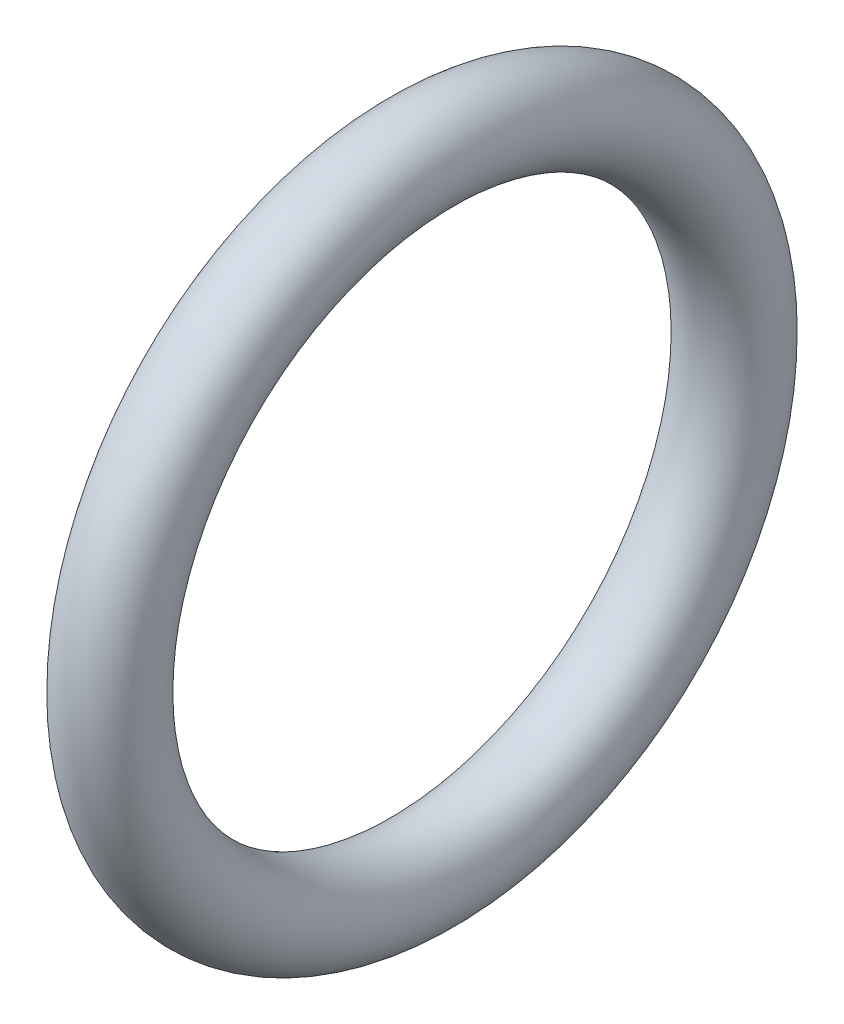
ISO-10303-21;
HEADER;
FILE_DESCRIPTION(('STEP AP214'),'2;1');
FILE_NAME('part.step','',(''),(''),'','','');
FILE_SCHEMA(('AUTOMOTIVE_DESIGN { 1 0 10303 214 1 1 1 1 }'));
ENDSEC;
DATA;
#1=APPLICATION_CONTEXT('core data for automotive mechanical design processes');
#2=APPLICATION_PROTOCOL_DEFINITION('international standard','automotive_design',2000,#1);
#3=PRODUCT_CONTEXT('',#1,'mechanical');
#4=PRODUCT('Part','Part','',(#3));
#5=PRODUCT_RELATED_PRODUCT_CATEGORY('part','',(#4));
#6=PRODUCT_DEFINITION_FORMATION('','',#4);
#7=PRODUCT_DEFINITION_CONTEXT('part definition',#1,'design');
#8=PRODUCT_DEFINITION('design','',#6,#7);
#9=PRODUCT_DEFINITION_SHAPE('','',#8);
#10=(LENGTH_UNIT() NAMED_UNIT(*) SI_UNIT(.MILLI.,.METRE.));
#11=(NAMED_UNIT(*) PLANE_ANGLE_UNIT() SI_UNIT($,.RADIAN.));
#12=(NAMED_UNIT(*) SI_UNIT($,.STERADIAN.) SOLID_ANGLE_UNIT());
#13=UNCERTAINTY_MEASURE_WITH_UNIT(LENGTH_MEASURE(1.E-05),#10,'distance_accuracy_value','');
#14=(GEOMETRIC_REPRESENTATION_CONTEXT(3) GLOBAL_UNCERTAINTY_ASSIGNED_CONTEXT((#13)) GLOBAL_UNIT_ASSIGNED_CONTEXT((#10,
#11,#12)) REPRESENTATION_CONTEXT('',''));
#15=CARTESIAN_POINT('',(0.,0.,0.));
#16=DIRECTION('',(0.,0.,1.));
#17=DIRECTION('',(1.,0.,0.));
#18=AXIS2_PLACEMENT_3D('',#15,#16,#17);
#19=CARTESIAN_POINT('',(0.,0.,0.));
#20=DIRECTION('',(-1.,0.,0.));
#21=DIRECTION('',(0.,0.,1.));
#22=AXIS2_PLACEMENT_3D('',#19,#20,#21);
#23=TOROIDAL_SURFACE('',#22,10.5,1.5);
#24=CARTESIAN_POINT('',(0.,0.,12.));
#25=VERTEX_POINT('',#24);
#26=VERTEX_LOOP('',#25);
#27=FACE_BOUND('',#26,.T.);
#28=ADVANCED_FACE('F346',(#27),#23,.T.);
#29=CLOSED_SHELL('',(#28));
#30=MANIFOLD_SOLID_BREP('B2',#29);
#31=ADVANCED_BREP_SHAPE_REPRESENTATION('',(#18,#30),#14);
#32=SHAPE_DEFINITION_REPRESENTATION(#9,#31);
ENDSEC;
END-ISO-10303-21;
